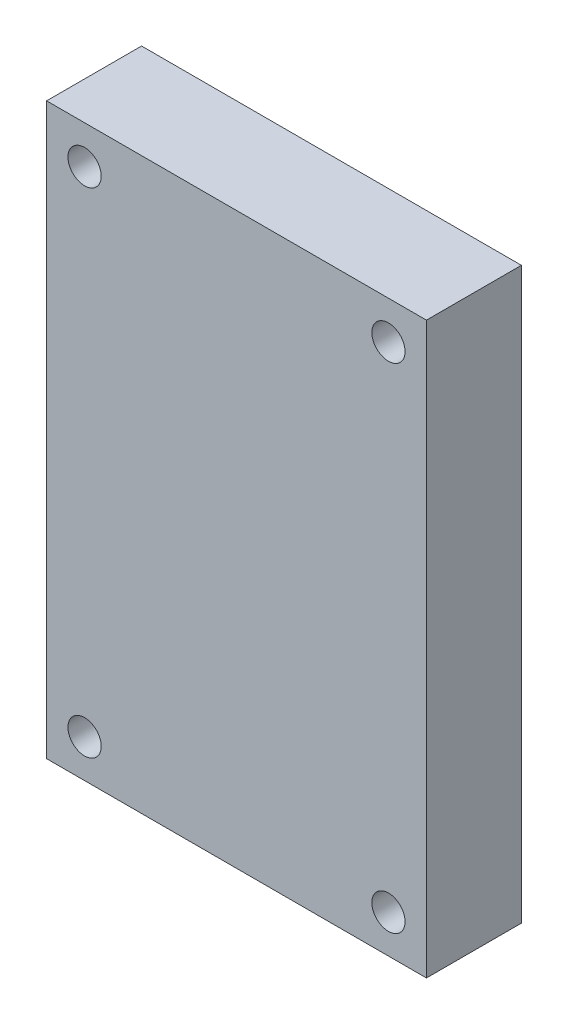
ISO-10303-21;
HEADER;
FILE_DESCRIPTION(('STEP AP214'),'2;1');
FILE_NAME('part.step','',(''),(''),'','','');
FILE_SCHEMA(('AUTOMOTIVE_DESIGN { 1 0 10303 214 1 1 1 1 }'));
ENDSEC;
DATA;
#1=APPLICATION_CONTEXT('core data for automotive mechanical design processes');
#2=APPLICATION_PROTOCOL_DEFINITION('international standard','automotive_design',2000,#1);
#3=PRODUCT_CONTEXT('',#1,'mechanical');
#4=PRODUCT('Part','Part','',(#3));
#5=PRODUCT_RELATED_PRODUCT_CATEGORY('part','',(#4));
#6=PRODUCT_DEFINITION_FORMATION('','',#4);
#7=PRODUCT_DEFINITION_CONTEXT('part definition',#1,'design');
#8=PRODUCT_DEFINITION('design','',#6,#7);
#9=PRODUCT_DEFINITION_SHAPE('','',#8);
#10=(LENGTH_UNIT() NAMED_UNIT(*) SI_UNIT(.MILLI.,.METRE.));
#11=(NAMED_UNIT(*) PLANE_ANGLE_UNIT() SI_UNIT($,.RADIAN.));
#12=(NAMED_UNIT(*) SI_UNIT($,.STERADIAN.) SOLID_ANGLE_UNIT());
#13=UNCERTAINTY_MEASURE_WITH_UNIT(LENGTH_MEASURE(1.E-05),#10,'distance_accuracy_value','');
#14=(GEOMETRIC_REPRESENTATION_CONTEXT(3) GLOBAL_UNCERTAINTY_ASSIGNED_CONTEXT((#13)) GLOBAL_UNIT_ASSIGNED_CONTEXT((#10,
#11,#12)) REPRESENTATION_CONTEXT('',''));
#15=CARTESIAN_POINT('',(0.,0.,0.));
#16=DIRECTION('',(0.,0.,1.));
#17=DIRECTION('',(1.,0.,0.));
#18=AXIS2_PLACEMENT_3D('',#15,#16,#17);
#19=CARTESIAN_POINT('',(0.,0.,10.));
#20=DIRECTION('',(0.,0.,-1.));
#21=DIRECTION('',(-1.,0.,0.));
#22=AXIS2_PLACEMENT_3D('',#19,#20,#21);
#23=PLANE('',#22);
#24=DIRECTION('',(0.,1.,0.));
#25=VECTOR('',#24,1.);
#26=CARTESIAN_POINT('',(20.,-30.,10.));
#27=LINE('',#26,#25);
#28=CARTESIAN_POINT('',(20.,-30.,10.));
#29=VERTEX_POINT('',#28);
#30=CARTESIAN_POINT('',(20.,30.,10.));
#31=VERTEX_POINT('',#30);
#32=EDGE_CURVE('E91',#29,#31,#27,.T.);
#33=ORIENTED_EDGE('',*,*,#32,.T.);
#34=DIRECTION('',(-1.,0.,0.));
#35=VECTOR('',#34,1.);
#36=CARTESIAN_POINT('',(-20.,30.,10.));
#37=LINE('',#36,#35);
#38=CARTESIAN_POINT('',(-20.,30.,10.));
#39=VERTEX_POINT('',#38);
#40=EDGE_CURVE('E86',#31,#39,#37,.T.);
#41=ORIENTED_EDGE('',*,*,#40,.T.);
#42=DIRECTION('',(0.,-1.,0.));
#43=VECTOR('',#42,1.);
#44=CARTESIAN_POINT('',(-20.,-30.,10.));
#45=LINE('',#44,#43);
#46=CARTESIAN_POINT('',(-20.,-30.,10.));
#47=VERTEX_POINT('',#46);
#48=EDGE_CURVE('E89',#39,#47,#45,.T.);
#49=ORIENTED_EDGE('',*,*,#48,.T.);
#50=DIRECTION('',(1.,0.,0.));
#51=VECTOR('',#50,1.);
#52=CARTESIAN_POINT('',(-20.,-30.,10.));
#53=LINE('',#52,#51);
#54=EDGE_CURVE('E56',#47,#29,#53,.T.);
#55=ORIENTED_EDGE('',*,*,#54,.T.);
#56=EDGE_LOOP('',(#33,#41,#49,#55));
#57=FACE_BOUND('',#56,.T.);
#58=CARTESIAN_POINT('',(-16.,26.,10.));
#59=DIRECTION('',(0.,0.,1.));
#60=DIRECTION('',(1.,0.,0.));
#61=AXIS2_PLACEMENT_3D('',#58,#59,#60);
#62=CIRCLE('',#61,1.75);
#63=CARTESIAN_POINT('',(-14.25,26.,10.));
#64=VERTEX_POINT('',#63);
#65=EDGE_CURVE('E107',#64,#64,#62,.T.);
#66=ORIENTED_EDGE('',*,*,#65,.F.);
#67=EDGE_LOOP('',(#66));
#68=FACE_BOUND('',#67,.T.);
#69=CARTESIAN_POINT('',(16.,26.,10.));
#70=DIRECTION('',(0.,0.,1.));
#71=DIRECTION('',(1.,0.,0.));
#72=AXIS2_PLACEMENT_3D('',#69,#70,#71);
#73=CIRCLE('',#72,1.75);
#74=CARTESIAN_POINT('',(17.75,26.,10.));
#75=VERTEX_POINT('',#74);
#76=EDGE_CURVE('E133',#75,#75,#73,.T.);
#77=ORIENTED_EDGE('',*,*,#76,.F.);
#78=EDGE_LOOP('',(#77));
#79=FACE_BOUND('',#78,.T.);
#80=CARTESIAN_POINT('',(16.,-26.,10.));
#81=DIRECTION('',(0.,0.,1.));
#82=DIRECTION('',(1.,0.,0.));
#83=AXIS2_PLACEMENT_3D('',#80,#81,#82);
#84=CIRCLE('',#83,1.75);
#85=CARTESIAN_POINT('',(17.75,-26.,10.));
#86=VERTEX_POINT('',#85);
#87=EDGE_CURVE('E128',#86,#86,#84,.T.);
#88=ORIENTED_EDGE('',*,*,#87,.F.);
#89=EDGE_LOOP('',(#88));
#90=FACE_BOUND('',#89,.T.);
#91=CARTESIAN_POINT('',(-16.,-26.,10.));
#92=DIRECTION('',(0.,0.,1.));
#93=DIRECTION('',(1.,0.,0.));
#94=AXIS2_PLACEMENT_3D('',#91,#92,#93);
#95=CIRCLE('',#94,1.75);
#96=CARTESIAN_POINT('',(-14.25,-26.,10.));
#97=VERTEX_POINT('',#96);
#98=EDGE_CURVE('E124',#97,#97,#95,.T.);
#99=ORIENTED_EDGE('',*,*,#98,.F.);
#100=EDGE_LOOP('',(#99));
#101=FACE_BOUND('',#100,.T.);
#102=ADVANCED_FACE('F37',(#57,#68,#79,#90,#101),#23,.F.);
#103=CARTESIAN_POINT('',(0.,0.,0.));
#104=DIRECTION('',(0.,0.,-1.));
#105=DIRECTION('',(-1.,0.,0.));
#106=AXIS2_PLACEMENT_3D('',#103,#104,#105);
#107=PLANE('',#106);
#108=CARTESIAN_POINT('',(-16.,26.,0.));
#109=DIRECTION('',(0.,0.,1.));
#110=DIRECTION('',(1.,0.,0.));
#111=AXIS2_PLACEMENT_3D('',#108,#109,#110);
#112=CIRCLE('',#111,3.);
#113=CARTESIAN_POINT('',(-13.,26.,0.));
#114=VERTEX_POINT('',#113);
#115=EDGE_CURVE('E321',#114,#114,#112,.T.);
#116=ORIENTED_EDGE('',*,*,#115,.T.);
#117=EDGE_LOOP('',(#116));
#118=FACE_BOUND('',#117,.T.);
#119=CARTESIAN_POINT('',(16.,-26.,0.));
#120=DIRECTION('',(0.,0.,1.));
#121=DIRECTION('',(1.,0.,0.));
#122=AXIS2_PLACEMENT_3D('',#119,#120,#121);
#123=CIRCLE('',#122,3.);
#124=CARTESIAN_POINT('',(19.,-26.,0.));
#125=VERTEX_POINT('',#124);
#126=EDGE_CURVE('E333',#125,#125,#123,.T.);
#127=ORIENTED_EDGE('',*,*,#126,.T.);
#128=EDGE_LOOP('',(#127));
#129=FACE_BOUND('',#128,.T.);
#130=CARTESIAN_POINT('',(-16.,-26.,0.));
#131=DIRECTION('',(0.,0.,1.));
#132=DIRECTION('',(1.,0.,0.));
#133=AXIS2_PLACEMENT_3D('',#130,#131,#132);
#134=CIRCLE('',#133,3.);
#135=CARTESIAN_POINT('',(-13.,-26.,0.));
#136=VERTEX_POINT('',#135);
#137=EDGE_CURVE('E328',#136,#136,#134,.T.);
#138=ORIENTED_EDGE('',*,*,#137,.T.);
#139=EDGE_LOOP('',(#138));
#140=FACE_BOUND('',#139,.T.);
#141=CARTESIAN_POINT('',(16.,26.,0.));
#142=DIRECTION('',(0.,0.,1.));
#143=DIRECTION('',(1.,0.,0.));
#144=AXIS2_PLACEMENT_3D('',#141,#142,#143);
#145=CIRCLE('',#144,3.);
#146=CARTESIAN_POINT('',(19.,26.,0.));
#147=VERTEX_POINT('',#146);
#148=EDGE_CURVE('E136',#147,#147,#145,.T.);
#149=ORIENTED_EDGE('',*,*,#148,.T.);
#150=EDGE_LOOP('',(#149));
#151=FACE_BOUND('',#150,.T.);
#152=DIRECTION('',(0.,1.,0.));
#153=VECTOR('',#152,1.);
#154=CARTESIAN_POINT('',(20.,-30.,0.));
#155=LINE('',#154,#153);
#156=CARTESIAN_POINT('',(20.,-30.,0.));
#157=VERTEX_POINT('',#156);
#158=CARTESIAN_POINT('',(20.,30.,0.));
#159=VERTEX_POINT('',#158);
#160=EDGE_CURVE('E104',#157,#159,#155,.T.);
#161=ORIENTED_EDGE('',*,*,#160,.F.);
#162=DIRECTION('',(1.,0.,0.));
#163=VECTOR('',#162,1.);
#164=CARTESIAN_POINT('',(-20.,-30.,0.));
#165=LINE('',#164,#163);
#166=CARTESIAN_POINT('',(-20.,-30.,0.));
#167=VERTEX_POINT('',#166);
#168=EDGE_CURVE('E79',#167,#157,#165,.T.);
#169=ORIENTED_EDGE('',*,*,#168,.F.);
#170=DIRECTION('',(0.,-1.,0.));
#171=VECTOR('',#170,1.);
#172=CARTESIAN_POINT('',(-20.,-30.,0.));
#173=LINE('',#172,#171);
#174=CARTESIAN_POINT('',(-20.,30.,0.));
#175=VERTEX_POINT('',#174);
#176=EDGE_CURVE('E73',#175,#167,#173,.T.);
#177=ORIENTED_EDGE('',*,*,#176,.F.);
#178=DIRECTION('',(-1.,0.,0.));
#179=VECTOR('',#178,1.);
#180=CARTESIAN_POINT('',(-20.,30.,0.));
#181=LINE('',#180,#179);
#182=EDGE_CURVE('E95',#159,#175,#181,.T.);
#183=ORIENTED_EDGE('',*,*,#182,.F.);
#184=EDGE_LOOP('',(#161,#169,#177,#183));
#185=FACE_BOUND('',#184,.T.);
#186=ADVANCED_FACE('F147',(#118,#129,#140,#151,#185),#107,.T.);
#187=CARTESIAN_POINT('',(20.,-30.,10.));
#188=DIRECTION('',(-1.,0.,0.));
#189=DIRECTION('',(0.,0.,1.));
#190=AXIS2_PLACEMENT_3D('',#187,#188,#189);
#191=PLANE('',#190);
#192=ORIENTED_EDGE('',*,*,#160,.T.);
#193=DIRECTION('',(0.,0.,-1.));
#194=VECTOR('',#193,1.);
#195=CARTESIAN_POINT('',(20.,30.,10.));
#196=LINE('',#195,#194);
#197=EDGE_CURVE('E11',#31,#159,#196,.T.);
#198=ORIENTED_EDGE('',*,*,#197,.F.);
#199=ORIENTED_EDGE('',*,*,#32,.F.);
#200=DIRECTION('',(0.,0.,-1.));
#201=VECTOR('',#200,1.);
#202=CARTESIAN_POINT('',(20.,-30.,10.));
#203=LINE('',#202,#201);
#204=EDGE_CURVE('E100',#29,#157,#203,.T.);
#205=ORIENTED_EDGE('',*,*,#204,.T.);
#206=EDGE_LOOP('',(#192,#198,#199,#205));
#207=FACE_BOUND('',#206,.T.);
#208=ADVANCED_FACE('F39',(#207),#191,.F.);
#209=CARTESIAN_POINT('',(-20.,30.,10.));
#210=DIRECTION('',(0.,-1.,0.));
#211=DIRECTION('',(0.,0.,-1.));
#212=AXIS2_PLACEMENT_3D('',#209,#210,#211);
#213=PLANE('',#212);
#214=ORIENTED_EDGE('',*,*,#182,.T.);
#215=DIRECTION('',(0.,0.,-1.));
#216=VECTOR('',#215,1.);
#217=CARTESIAN_POINT('',(-20.,30.,10.));
#218=LINE('',#217,#216);
#219=EDGE_CURVE('E47',#39,#175,#218,.T.);
#220=ORIENTED_EDGE('',*,*,#219,.F.);
#221=ORIENTED_EDGE('',*,*,#40,.F.);
#222=ORIENTED_EDGE('',*,*,#197,.T.);
#223=EDGE_LOOP('',(#214,#220,#221,#222));
#224=FACE_BOUND('',#223,.T.);
#225=ADVANCED_FACE('F94',(#224),#213,.F.);
#226=CARTESIAN_POINT('',(-20.,-30.,10.));
#227=DIRECTION('',(1.,0.,0.));
#228=DIRECTION('',(0.,0.,-1.));
#229=AXIS2_PLACEMENT_3D('',#226,#227,#228);
#230=PLANE('',#229);
#231=ORIENTED_EDGE('',*,*,#176,.T.);
#232=DIRECTION('',(0.,0.,-1.));
#233=VECTOR('',#232,1.);
#234=CARTESIAN_POINT('',(-20.,-30.,10.));
#235=LINE('',#234,#233);
#236=EDGE_CURVE('E96',#47,#167,#235,.T.);
#237=ORIENTED_EDGE('',*,*,#236,.F.);
#238=ORIENTED_EDGE('',*,*,#48,.F.);
#239=ORIENTED_EDGE('',*,*,#219,.T.);
#240=EDGE_LOOP('',(#231,#237,#238,#239));
#241=FACE_BOUND('',#240,.T.);
#242=ADVANCED_FACE('F98',(#241),#230,.F.);
#243=CARTESIAN_POINT('',(-20.,-30.,10.));
#244=DIRECTION('',(0.,1.,0.));
#245=DIRECTION('',(0.,0.,1.));
#246=AXIS2_PLACEMENT_3D('',#243,#244,#245);
#247=PLANE('',#246);
#248=ORIENTED_EDGE('',*,*,#168,.T.);
#249=ORIENTED_EDGE('',*,*,#204,.F.);
#250=ORIENTED_EDGE('',*,*,#54,.F.);
#251=ORIENTED_EDGE('',*,*,#236,.T.);
#252=EDGE_LOOP('',(#248,#249,#250,#251));
#253=FACE_BOUND('',#252,.T.);
#254=ADVANCED_FACE('F173',(#253),#247,.F.);
#255=CARTESIAN_POINT('',(-16.,26.,10.));
#256=DIRECTION('',(0.,0.,-1.));
#257=DIRECTION('',(-1.,0.,0.));
#258=AXIS2_PLACEMENT_3D('',#255,#256,#257);
#259=CYLINDRICAL_SURFACE('',#258,1.75);
#260=CARTESIAN_POINT('',(-16.,26.,5.));
#261=DIRECTION('',(0.,0.,1.));
#262=DIRECTION('',(1.,0.,0.));
#263=AXIS2_PLACEMENT_3D('',#260,#261,#262);
#264=CIRCLE('',#263,1.75);
#265=CARTESIAN_POINT('',(-14.25,26.,5.));
#266=VERTEX_POINT('',#265);
#267=EDGE_CURVE('E41',#266,#266,#264,.T.);
#268=ORIENTED_EDGE('',*,*,#267,.F.);
#269=EDGE_LOOP('',(#268));
#270=FACE_BOUND('',#269,.T.);
#271=ORIENTED_EDGE('',*,*,#65,.T.);
#272=EDGE_LOOP('',(#271));
#273=FACE_BOUND('',#272,.T.);
#274=ADVANCED_FACE('F144',(#270,#273),#259,.F.);
#275=CARTESIAN_POINT('',(16.,26.,10.));
#276=DIRECTION('',(0.,0.,-1.));
#277=DIRECTION('',(-1.,0.,0.));
#278=AXIS2_PLACEMENT_3D('',#275,#276,#277);
#279=CYLINDRICAL_SURFACE('',#278,1.75);
#280=CARTESIAN_POINT('',(16.,26.,5.));
#281=DIRECTION('',(0.,0.,1.));
#282=DIRECTION('',(1.,0.,0.));
#283=AXIS2_PLACEMENT_3D('',#280,#281,#282);
#284=CIRCLE('',#283,1.75);
#285=CARTESIAN_POINT('',(17.75,26.,5.));
#286=VERTEX_POINT('',#285);
#287=EDGE_CURVE('E119',#286,#286,#284,.T.);
#288=ORIENTED_EDGE('',*,*,#287,.F.);
#289=EDGE_LOOP('',(#288));
#290=FACE_BOUND('',#289,.T.);
#291=ORIENTED_EDGE('',*,*,#76,.T.);
#292=EDGE_LOOP('',(#291));
#293=FACE_BOUND('',#292,.T.);
#294=ADVANCED_FACE('F157',(#290,#293),#279,.F.);
#295=CARTESIAN_POINT('',(16.,-26.,10.));
#296=DIRECTION('',(0.,0.,-1.));
#297=DIRECTION('',(-1.,0.,0.));
#298=AXIS2_PLACEMENT_3D('',#295,#296,#297);
#299=CYLINDRICAL_SURFACE('',#298,1.75);
#300=CARTESIAN_POINT('',(16.,-26.,5.));
#301=DIRECTION('',(0.,0.,1.));
#302=DIRECTION('',(1.,0.,0.));
#303=AXIS2_PLACEMENT_3D('',#300,#301,#302);
#304=CIRCLE('',#303,1.75);
#305=CARTESIAN_POINT('',(17.75,-26.,5.));
#306=VERTEX_POINT('',#305);
#307=EDGE_CURVE('E116',#306,#306,#304,.T.);
#308=ORIENTED_EDGE('',*,*,#307,.F.);
#309=EDGE_LOOP('',(#308));
#310=FACE_BOUND('',#309,.T.);
#311=ORIENTED_EDGE('',*,*,#87,.T.);
#312=EDGE_LOOP('',(#311));
#313=FACE_BOUND('',#312,.T.);
#314=ADVANCED_FACE('F154',(#310,#313),#299,.F.);
#315=CARTESIAN_POINT('',(-16.,-26.,10.));
#316=DIRECTION('',(0.,0.,-1.));
#317=DIRECTION('',(-1.,0.,0.));
#318=AXIS2_PLACEMENT_3D('',#315,#316,#317);
#319=CYLINDRICAL_SURFACE('',#318,1.75);
#320=CARTESIAN_POINT('',(-16.,-26.,5.));
#321=DIRECTION('',(0.,0.,1.));
#322=DIRECTION('',(1.,0.,0.));
#323=AXIS2_PLACEMENT_3D('',#320,#321,#322);
#324=CIRCLE('',#323,1.75);
#325=CARTESIAN_POINT('',(-14.25,-26.,5.));
#326=VERTEX_POINT('',#325);
#327=EDGE_CURVE('E113',#326,#326,#324,.T.);
#328=ORIENTED_EDGE('',*,*,#327,.F.);
#329=EDGE_LOOP('',(#328));
#330=FACE_BOUND('',#329,.T.);
#331=ORIENTED_EDGE('',*,*,#98,.T.);
#332=EDGE_LOOP('',(#331));
#333=FACE_BOUND('',#332,.T.);
#334=ADVANCED_FACE('F156',(#330,#333),#319,.F.);
#335=CARTESIAN_POINT('',(-16.,-26.,5.));
#336=DIRECTION('',(0.,0.,-1.));
#337=DIRECTION('',(-1.,0.,0.));
#338=AXIS2_PLACEMENT_3D('',#335,#336,#337);
#339=CYLINDRICAL_SURFACE('',#338,3.);
#340=CARTESIAN_POINT('',(-16.,-26.,5.));
#341=DIRECTION('',(0.,0.,1.));
#342=DIRECTION('',(1.,0.,0.));
#343=AXIS2_PLACEMENT_3D('',#340,#341,#342);
#344=CIRCLE('',#343,3.);
#345=CARTESIAN_POINT('',(-13.,-26.,5.));
#346=VERTEX_POINT('',#345);
#347=EDGE_CURVE('E335',#346,#346,#344,.T.);
#348=ORIENTED_EDGE('',*,*,#347,.T.);
#349=EDGE_LOOP('',(#348));
#350=FACE_BOUND('',#349,.T.);
#351=ORIENTED_EDGE('',*,*,#137,.F.);
#352=EDGE_LOOP('',(#351));
#353=FACE_BOUND('',#352,.T.);
#354=ADVANCED_FACE('F164',(#350,#353),#339,.F.);
#355=CARTESIAN_POINT('',(-16.,-26.,5.));
#356=DIRECTION('',(0.,0.,1.));
#357=DIRECTION('',(1.,0.,0.));
#358=AXIS2_PLACEMENT_3D('',#355,#356,#357);
#359=PLANE('',#358);
#360=ORIENTED_EDGE('',*,*,#327,.T.);
#361=EDGE_LOOP('',(#360));
#362=FACE_BOUND('',#361,.T.);
#363=ORIENTED_EDGE('',*,*,#347,.F.);
#364=EDGE_LOOP('',(#363));
#365=FACE_BOUND('',#364,.T.);
#366=ADVANCED_FACE('F246',(#362,#365),#359,.F.);
#367=CARTESIAN_POINT('',(16.,-26.,5.));
#368=DIRECTION('',(0.,0.,-1.));
#369=DIRECTION('',(-1.,0.,0.));
#370=AXIS2_PLACEMENT_3D('',#367,#368,#369);
#371=CYLINDRICAL_SURFACE('',#370,3.);
#372=CARTESIAN_POINT('',(16.,-26.,5.));
#373=DIRECTION('',(0.,0.,1.));
#374=DIRECTION('',(1.,0.,0.));
#375=AXIS2_PLACEMENT_3D('',#372,#373,#374);
#376=CIRCLE('',#375,3.);
#377=CARTESIAN_POINT('',(19.,-26.,5.));
#378=VERTEX_POINT('',#377);
#379=EDGE_CURVE('E325',#378,#378,#376,.T.);
#380=ORIENTED_EDGE('',*,*,#379,.T.);
#381=EDGE_LOOP('',(#380));
#382=FACE_BOUND('',#381,.T.);
#383=ORIENTED_EDGE('',*,*,#126,.F.);
#384=EDGE_LOOP('',(#383));
#385=FACE_BOUND('',#384,.T.);
#386=ADVANCED_FACE('F255',(#382,#385),#371,.F.);
#387=CARTESIAN_POINT('',(16.,-26.,5.));
#388=DIRECTION('',(0.,0.,1.));
#389=DIRECTION('',(1.,0.,0.));
#390=AXIS2_PLACEMENT_3D('',#387,#388,#389);
#391=PLANE('',#390);
#392=ORIENTED_EDGE('',*,*,#307,.T.);
#393=EDGE_LOOP('',(#392));
#394=FACE_BOUND('',#393,.T.);
#395=ORIENTED_EDGE('',*,*,#379,.F.);
#396=EDGE_LOOP('',(#395));
#397=FACE_BOUND('',#396,.T.);
#398=ADVANCED_FACE('F264',(#394,#397),#391,.F.);
#399=CARTESIAN_POINT('',(16.,26.,5.));
#400=DIRECTION('',(0.,0.,-1.));
#401=DIRECTION('',(-1.,0.,0.));
#402=AXIS2_PLACEMENT_3D('',#399,#400,#401);
#403=CYLINDRICAL_SURFACE('',#402,3.);
#404=CARTESIAN_POINT('',(16.,26.,5.));
#405=DIRECTION('',(0.,0.,1.));
#406=DIRECTION('',(1.,0.,0.));
#407=AXIS2_PLACEMENT_3D('',#404,#405,#406);
#408=CIRCLE('',#407,3.);
#409=CARTESIAN_POINT('',(19.,26.,5.));
#410=VERTEX_POINT('',#409);
#411=EDGE_CURVE('E117',#410,#410,#408,.T.);
#412=ORIENTED_EDGE('',*,*,#411,.T.);
#413=EDGE_LOOP('',(#412));
#414=FACE_BOUND('',#413,.T.);
#415=ORIENTED_EDGE('',*,*,#148,.F.);
#416=EDGE_LOOP('',(#415));
#417=FACE_BOUND('',#416,.T.);
#418=ADVANCED_FACE('F273',(#414,#417),#403,.F.);
#419=CARTESIAN_POINT('',(16.,26.,5.));
#420=DIRECTION('',(0.,0.,1.));
#421=DIRECTION('',(1.,0.,0.));
#422=AXIS2_PLACEMENT_3D('',#419,#420,#421);
#423=PLANE('',#422);
#424=ORIENTED_EDGE('',*,*,#287,.T.);
#425=EDGE_LOOP('',(#424));
#426=FACE_BOUND('',#425,.T.);
#427=ORIENTED_EDGE('',*,*,#411,.F.);
#428=EDGE_LOOP('',(#427));
#429=FACE_BOUND('',#428,.T.);
#430=ADVANCED_FACE('F282',(#426,#429),#423,.F.);
#431=CARTESIAN_POINT('',(-16.,26.,5.));
#432=DIRECTION('',(0.,0.,-1.));
#433=DIRECTION('',(-1.,0.,0.));
#434=AXIS2_PLACEMENT_3D('',#431,#432,#433);
#435=CYLINDRICAL_SURFACE('',#434,3.);
#436=CARTESIAN_POINT('',(-16.,26.,5.));
#437=DIRECTION('',(0.,0.,1.));
#438=DIRECTION('',(1.,0.,0.));
#439=AXIS2_PLACEMENT_3D('',#436,#437,#438);
#440=CIRCLE('',#439,3.);
#441=CARTESIAN_POINT('',(-13.,26.,5.));
#442=VERTEX_POINT('',#441);
#443=EDGE_CURVE('E320',#442,#442,#440,.T.);
#444=ORIENTED_EDGE('',*,*,#443,.T.);
#445=EDGE_LOOP('',(#444));
#446=FACE_BOUND('',#445,.T.);
#447=ORIENTED_EDGE('',*,*,#115,.F.);
#448=EDGE_LOOP('',(#447));
#449=FACE_BOUND('',#448,.T.);
#450=ADVANCED_FACE('F290',(#446,#449),#435,.F.);
#451=CARTESIAN_POINT('',(-16.,26.,5.));
#452=DIRECTION('',(0.,0.,1.));
#453=DIRECTION('',(1.,0.,0.));
#454=AXIS2_PLACEMENT_3D('',#451,#452,#453);
#455=PLANE('',#454);
#456=ORIENTED_EDGE('',*,*,#267,.T.);
#457=EDGE_LOOP('',(#456));
#458=FACE_BOUND('',#457,.T.);
#459=ORIENTED_EDGE('',*,*,#443,.F.);
#460=EDGE_LOOP('',(#459));
#461=FACE_BOUND('',#460,.T.);
#462=ADVANCED_FACE('F298',(#458,#461),#455,.F.);
#463=CLOSED_SHELL('',(#102,#186,#208,#225,#242,#254,#274,#294,#314,#334,#354,#366,#386,#398,
#418,#430,#450,#462));
#464=MANIFOLD_SOLID_BREP('B2',#463);
#465=ADVANCED_BREP_SHAPE_REPRESENTATION('',(#18,#464),#14);
#466=SHAPE_DEFINITION_REPRESENTATION(#9,#465);
ENDSEC;
END-ISO-10303-21;
